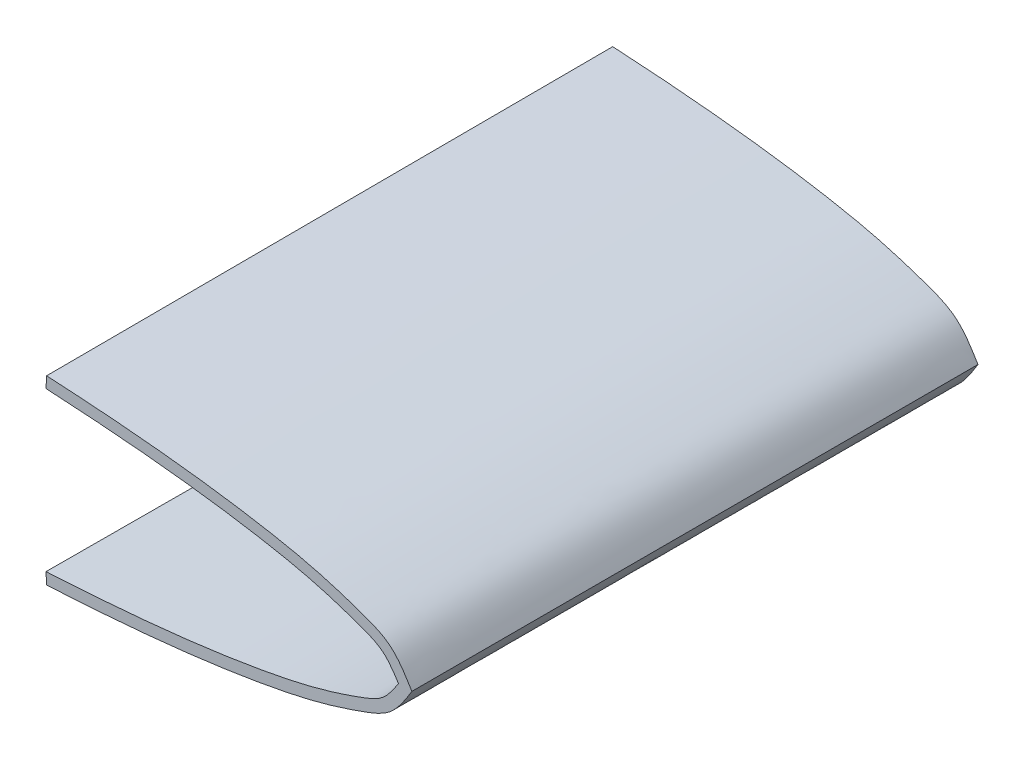
ISO-10303-21;
HEADER;
FILE_DESCRIPTION(('STEP AP214'),'2;1');
FILE_NAME('part.step','',(''),(''),'','','');
FILE_SCHEMA(('AUTOMOTIVE_DESIGN { 1 0 10303 214 1 1 1 1 }'));
ENDSEC;
DATA;
#1=APPLICATION_CONTEXT('core data for automotive mechanical design processes');
#2=APPLICATION_PROTOCOL_DEFINITION('international standard','automotive_design',2000,#1);
#3=PRODUCT_CONTEXT('',#1,'mechanical');
#4=PRODUCT('Part','Part','',(#3));
#5=PRODUCT_RELATED_PRODUCT_CATEGORY('part','',(#4));
#6=PRODUCT_DEFINITION_FORMATION('','',#4);
#7=PRODUCT_DEFINITION_CONTEXT('part definition',#1,'design');
#8=PRODUCT_DEFINITION('design','',#6,#7);
#9=PRODUCT_DEFINITION_SHAPE('','',#8);
#10=(LENGTH_UNIT() NAMED_UNIT(*) SI_UNIT(.MILLI.,.METRE.));
#11=(NAMED_UNIT(*) PLANE_ANGLE_UNIT() SI_UNIT($,.RADIAN.));
#12=(NAMED_UNIT(*) SI_UNIT($,.STERADIAN.) SOLID_ANGLE_UNIT());
#13=UNCERTAINTY_MEASURE_WITH_UNIT(LENGTH_MEASURE(1.E-05),#10,'distance_accuracy_value','');
#14=(GEOMETRIC_REPRESENTATION_CONTEXT(3) GLOBAL_UNCERTAINTY_ASSIGNED_CONTEXT((#13)) GLOBAL_UNIT_ASSIGNED_CONTEXT((#10,
#11,#12)) REPRESENTATION_CONTEXT('',''));
#15=CARTESIAN_POINT('',(0.,0.,0.));
#16=DIRECTION('',(0.,0.,1.));
#17=DIRECTION('',(1.,0.,0.));
#18=AXIS2_PLACEMENT_3D('',#15,#16,#17);
#19=CARTESIAN_POINT('',(42.4994409675227,-7.78666682857099,-78.7400000000001));
#20=DIRECTION('',(0.,0.,1.));
#21=DIRECTION('',(1.,0.,0.));
#22=AXIS2_PLACEMENT_3D('',#19,#20,#21);
#23=PLANE('',#22);
#24=CARTESIAN_POINT('',(65.912918026067,-16.5582165461445,-78.7400000000001));
#25=CARTESIAN_POINT('',(65.4051754198435,-15.7414320824596,-78.7400000000001));
#26=CARTESIAN_POINT('',(64.8712305259762,-14.9342814721549,-78.7400000000001));
#27=CARTESIAN_POINT('',(64.1259820532635,-14.1435545116777,-78.7400000000001));
#28=CARTESIAN_POINT('',(63.7114342340601,-13.7326302608691,-78.7400000000001));
#29=CARTESIAN_POINT('',(63.0598625118335,-13.2573691826656,-78.7400000000001));
#30=CARTESIAN_POINT('',(62.4621181818974,-12.9413064471122,-78.7400000000001));
#31=CARTESIAN_POINT('',(61.8451279256446,-12.644236714314,-78.7400000000001));
#32=CARTESIAN_POINT('',(61.2975436619765,-12.426313317413,-78.7400000000001));
#33=CARTESIAN_POINT('',(59.7274700350331,-11.8352794065414,-78.7400000000001));
#34=CARTESIAN_POINT('',(58.5822872567446,-11.4474134725801,-78.7400000000001));
#35=CARTESIAN_POINT('',(55.7838469102679,-10.5476064946807,-78.7400000000001));
#36=CARTESIAN_POINT('',(52.9537695598002,-9.75512543055187,-78.7400000000001));
#37=CARTESIAN_POINT('',(49.8902545387719,-9.10224811646429,-78.7400000000001));
#38=CARTESIAN_POINT('',(46.9918907902114,-8.53013880862471,-78.7400000000001));
#39=CARTESIAN_POINT('',(41.9226182244394,-7.64302783359646,-78.7400000000001));
#40=CARTESIAN_POINT('',(31.4130047824203,-6.26711743418939,-78.7400000000001));
#41=CARTESIAN_POINT('',(22.5151023614594,-5.58006173367422,-78.7400000000001));
#42=CARTESIAN_POINT('',(16.8827203981453,-5.25617519469147,-78.7400000000001));
#43=B_SPLINE_CURVE_WITH_KNOTS('',3,(#24,#25,#26,#27,#28,#29,#30,#31,#32,#33,#34,#35,#36,#37,#38,
#39,#40,#41,#42),.UNSPECIFIED.,.F.,.F.,(4,2,1,1,2,1,1,2,1,1,1,1,1,4),(0.,0.056020952878219,
0.0632821412888892,0.0900386062661922,0.102780271260974,0.130001493018324,0.137052313819946,
0.200360371551541,0.308278431316947,0.371601011458721,0.382771952956304,0.480361358725566,
0.671367967232721,1.),.UNSPECIFIED.);
#44=CARTESIAN_POINT('',(65.9129180260669,-16.5582165461404,-78.7400000000001));
#45=VERTEX_POINT('',#44);
#46=CARTESIAN_POINT('',(16.8827203981453,-5.25617519469148,-78.7400000000001));
#47=VERTEX_POINT('',#46);
#48=EDGE_CURVE('E169',#45,#47,#43,.T.);
#49=ORIENTED_EDGE('',*,*,#48,.T.);
#50=DIRECTION('',(0.0574095221756193,0.998350713308488,0.));
#51=VECTOR('',#50,1.);
#52=CARTESIAN_POINT('',(16.8827203981453,-5.25617519469148,-78.7400000000001));
#53=LINE('',#52,#51);
#54=CARTESIAN_POINT('',(16.9738580145991,-3.67129343731425,-78.7400000000001));
#55=VERTEX_POINT('',#54);
#56=EDGE_CURVE('E12',#47,#55,#53,.T.);
#57=ORIENTED_EDGE('',*,*,#56,.T.);
#58=CARTESIAN_POINT('',(16.9738580145991,-3.67129343731425,-78.7400000000001));
#59=CARTESIAN_POINT('',(21.3610222432848,-3.92357452322658,-78.7400000000001));
#60=CARTESIAN_POINT('',(27.9320133204333,-4.40240207410101,-78.7400000000001));
#61=CARTESIAN_POINT('',(36.6850392393515,-5.35022984393427,-78.7400000000001));
#62=CARTESIAN_POINT('',(42.1444388642442,-6.1023419339073,-78.7400000000001));
#63=CARTESIAN_POINT('',(46.5023997057977,-6.82833405509119,-78.7400000000001));
#64=CARTESIAN_POINT('',(49.7593752667435,-7.44445760496007,-78.7400000000001));
#65=CARTESIAN_POINT('',(53.0289719072204,-8.15982598000776,-78.7400000000001));
#66=CARTESIAN_POINT('',(55.7271254344392,-8.88694329866122,-78.7400000000001));
#67=CARTESIAN_POINT('',(57.8653806359954,-9.54410235808814,-78.7400000000001));
#68=CARTESIAN_POINT('',(59.4497461815499,-10.0636400416173,-78.7400000000001));
#69=CARTESIAN_POINT('',(61.0337248389187,-10.6286250642282,-78.7400000000001));
#70=CARTESIAN_POINT('',(62.6317137685341,-11.2192179546496,-78.7400000000001));
#71=CARTESIAN_POINT('',(64.117674304596,-12.0184266410054,-78.7400000000001));
#72=CARTESIAN_POINT('',(65.0481280840643,-12.8074853747339,-78.7400000000001));
#73=CARTESIAN_POINT('',(65.5200370370229,-13.3059644278922,-78.7400000000001));
#74=CARTESIAN_POINT('',(65.9305881033177,-13.7829529798619,-78.7400000000001));
#75=CARTESIAN_POINT('',(66.4022674273108,-14.4024174040977,-78.7400000000001));
#76=CARTESIAN_POINT('',(66.9019084305486,-15.1436815216202,-78.7400000000001));
#77=CARTESIAN_POINT('',(67.3532340427676,-15.8678189686269,-78.7400000000001));
#78=CARTESIAN_POINT('',(67.6378189373782,-16.3260391783732,-78.7400000000001));
#79=CARTESIAN_POINT('',(67.782148740542,-16.5582165442787,-78.7400000000001));
#80=B_SPLINE_CURVE_WITH_KNOTS('',3,(#58,#59,#60,#61,#62,#63,#64,#65,#66,#67,#68,#69,#70,#71,#72,
#73,#74,#75,#76,#77,#78,#79),.UNSPECIFIED.,.F.,.F.,(4,1,1,1,1,1,1,1,1,1,1,1,1,1,1,1,1,1,1,4),
(0.,0.254790297378543,0.382185446067814,0.509580594757086,0.573278169101721,0.636975743446357,
0.700673317790993,0.764370892135629,0.796219679307947,0.828068466480264,0.859917253652582,
0.8917660408249,0.923614827997218,0.939539221583377,0.947501418376457,0.955463615169536,
0.971388008755695,0.987312402341854,1.00323679592801,1.01916118951417),.UNSPECIFIED.);
#81=CARTESIAN_POINT('',(67.782148740542,-16.5582165442787,-78.7400000000001));
#82=VERTEX_POINT('',#81);
#83=EDGE_CURVE('E96',#55,#82,#80,.T.);
#84=ORIENTED_EDGE('',*,*,#83,.T.);
#85=CARTESIAN_POINT('',(67.782148740542,-16.5582165442787,-78.7400000000001));
#86=CARTESIAN_POINT('',(67.6378184565921,-16.7903946846373,-78.7400000000001));
#87=CARTESIAN_POINT('',(67.3531549981243,-17.248765457214,-78.7400000000001));
#88=CARTESIAN_POINT('',(66.7518512057312,-18.2133910674919,-78.7400000000001));
#89=CARTESIAN_POINT('',(66.0538964057146,-19.2154979421198,-78.7400000000001));
#90=CARTESIAN_POINT('',(65.176908755767,-20.1819038543453,-78.7400000000001));
#91=CARTESIAN_POINT('',(64.5405073235338,-20.7444835771353,-78.7400000000001));
#92=CARTESIAN_POINT('',(63.9413313096434,-21.1584819458414,-78.7400000000001));
#93=CARTESIAN_POINT('',(63.3855108058696,-21.4892270910685,-78.7400000000001));
#94=CARTESIAN_POINT('',(62.3765067056171,-21.9910944679847,-78.7400000000001));
#95=CARTESIAN_POINT('',(61.026726826321,-22.4979629506535,-78.7400000000001));
#96=CARTESIAN_POINT('',(59.4569303867627,-23.0509993557861,-78.7400000000001));
#97=CARTESIAN_POINT('',(57.8677527353638,-23.5777306943511,-78.7400000000001));
#98=CARTESIAN_POINT('',(55.7279227176323,-24.2324662856941,-78.7400000000001));
#99=CARTESIAN_POINT('',(53.0284573983001,-24.9570106459972,-78.7400000000001));
#100=CARTESIAN_POINT('',(49.761047516118,-25.6739619125,-78.7400000000001));
#101=CARTESIAN_POINT('',(46.5010333110795,-26.2901839296503,-78.7400000000001));
#102=CARTESIAN_POINT('',(42.1428085885765,-27.0117695085257,-78.7400000000001));
#103=CARTESIAN_POINT('',(36.6875991070444,-27.7663817006911,-78.7400000000001));
#104=CARTESIAN_POINT('',(27.9327690259257,-28.7196212502407,-78.7400000000001));
#105=CARTESIAN_POINT('',(21.3613786345462,-29.1928380833508,-78.7400000000001));
#106=CARTESIAN_POINT('',(16.9738580096687,-29.4451396552437,-78.7400000000001));
#107=B_SPLINE_CURVE_WITH_KNOTS('',3,(#85,#86,#87,#88,#89,#90,#91,#92,#93,#94,#95,#96,#97,#98,
#99,#100,#101,#102,#103,#104,#105,#106),.UNSPECIFIED.,.F.,.F.,(4,1,1,1,1,1,1,1,1,1,1,1,1,1,1,1,
1,1,1,4),(-0.0191611243996706,-0.00323673183092574,0.0126876607378191,0.0445364458753088,
0.0604608384440537,0.0763852310127985,0.084347427297171,0.0923096235815434,0.108234016150288,
0.140082801287778,0.171931586425268,0.203780371562757,0.235629156700247,0.299326726975226,
0.363024297250206,0.426721867525185,0.490419437800165,0.617814578350124,0.745209718900082,1.),.UNSPECIFIED.);
#108=CARTESIAN_POINT('',(16.9738580096687,-29.4451396552437,-78.7400000000001));
#109=VERTEX_POINT('',#108);
#110=EDGE_CURVE('E305',#82,#109,#107,.T.);
#111=ORIENTED_EDGE('',*,*,#110,.T.);
#112=DIRECTION('',(-0.057409520280624,0.998350713417459,0.));
#113=VECTOR('',#112,1.);
#114=CARTESIAN_POINT('',(16.9738580096687,-29.4451396552437,-78.7400000000001));
#115=LINE('',#114,#113);
#116=CARTESIAN_POINT('',(16.8827203962232,-27.8602578976934,-78.7400000000001));
#117=VERTEX_POINT('',#116);
#118=EDGE_CURVE('E308',#109,#117,#115,.T.);
#119=ORIENTED_EDGE('',*,*,#118,.T.);
#120=CARTESIAN_POINT('',(16.8827203962232,-27.8602578976934,-78.7400000000001));
#121=CARTESIAN_POINT('',(24.9224395055721,-27.3979389840536,-78.7400000000001));
#122=CARTESIAN_POINT('',(34.0403066335562,-26.6293291934245,-78.7400000000001));
#123=CARTESIAN_POINT('',(44.7284109682597,-24.9889687964561,-78.7400000000001));
#124=CARTESIAN_POINT('',(47.9217677201928,-24.4187160244967,-78.7400000000001));
#125=CARTESIAN_POINT('',(50.0334641952933,-23.9810752414718,-78.7400000000001));
#126=CARTESIAN_POINT('',(52.6478319019627,-23.4215867039075,-78.7400000000001));
#127=CARTESIAN_POINT('',(55.0037047582013,-22.8118127692071,-78.7400000000001));
#128=CARTESIAN_POINT('',(57.8775327491502,-21.9035287687069,-78.7400000000001));
#129=CARTESIAN_POINT('',(59.1313694309051,-21.4838236237442,-78.7400000000001));
#130=CARTESIAN_POINT('',(60.7555217704745,-20.9091152098904,-78.7400000000001));
#131=CARTESIAN_POINT('',(61.8166663329984,-20.4966226906722,-78.7400000000001));
#132=CARTESIAN_POINT('',(62.633467076932,-20.0859981347681,-78.7400000000001));
#133=CARTESIAN_POINT('',(62.8745534402461,-19.9500252331878,-78.7400000000001));
#134=CARTESIAN_POINT('',(63.4323963371715,-19.5917268397141,-78.7400000000001));
#135=CARTESIAN_POINT('',(63.9323024072292,-19.1819075029615,-78.7400000000001));
#136=CARTESIAN_POINT('',(64.91314080719,-18.1217083207127,-78.7400000000001));
#137=CARTESIAN_POINT('',(65.4925693023219,-17.234414100183,-78.7400000000001));
#138=CARTESIAN_POINT('',(65.9129180260669,-16.5582165461404,-78.7400000000001));
#139=B_SPLINE_CURVE_WITH_KNOTS('',3,(#120,#121,#122,#123,#124,#125,#126,#127,#128,#129,#130,
#131,#132,#133,#134,#135,#136,#137,#138),.UNSPECIFIED.,.F.,.F.,(4,1,1,1,2,1,1,1,1,2,2,1,1,4),
(0.,0.469095490609103,0.532399575259675,0.629870046051929,0.658029418698937,0.785616644807989,
0.799639973041673,0.833611529365395,0.862624477590298,0.899842883821135,0.916013478902435,
0.938504424064929,0.953621666156999,1.),.UNSPECIFIED.);
#140=EDGE_CURVE('E330',#117,#45,#139,.T.);
#141=ORIENTED_EDGE('',*,*,#140,.T.);
#142=EDGE_LOOP('',(#49,#57,#84,#111,#119,#141));
#143=FACE_BOUND('',#142,.T.);
#144=ADVANCED_FACE('F86',(#143),#23,.F.);
#145=CARTESIAN_POINT('',(43.0569285273842,-25.062787153739,0.));
#146=DIRECTION('',(0.,0.,-1.));
#147=DIRECTION('',(-1.,0.,0.));
#148=AXIS2_PLACEMENT_3D('',#145,#146,#147);
#149=PLANE('',#148);
#150=CARTESIAN_POINT('',(65.9127076514291,-16.5582165461401,0.));
#151=CARTESIAN_POINT('',(65.7711506115883,-16.7856422674928,0.));
#152=CARTESIAN_POINT('',(65.4783538594608,-17.2455414164728,0.));
#153=CARTESIAN_POINT('',(64.9008366287329,-18.081153769503,0.));
#154=CARTESIAN_POINT('',(64.145764091482,-18.986630750279,0.));
#155=CARTESIAN_POINT('',(63.211213658634,-19.7385838486893,0.));
#156=CARTESIAN_POINT('',(61.949242991473,-20.362231303004,0.));
#157=CARTESIAN_POINT('',(60.4252423684153,-20.9246372763417,0.));
#158=CARTESIAN_POINT('',(58.8717760787585,-21.4699070506127,0.));
#159=CARTESIAN_POINT('',(57.3349661757003,-21.9726447414802,0.));
#160=CARTESIAN_POINT('',(55.2816343610209,-22.594937775807,0.));
#161=CARTESIAN_POINT('',(52.6978617422679,-23.2733801040351,0.));
#162=CARTESIAN_POINT('',(49.5158465617297,-23.9536925868982,0.));
#163=CARTESIAN_POINT('',(46.2908662553914,-24.5457251850428,0.));
#164=CARTESIAN_POINT('',(41.9816901798967,-25.2484516364702,0.));
#165=CARTESIAN_POINT('',(36.5643850147354,-25.9771166526398,0.));
#166=CARTESIAN_POINT('',(27.8452707949958,-26.8858010750158,0.));
#167=CARTESIAN_POINT('',(21.2708834369739,-27.3451949173683,0.));
#168=CARTESIAN_POINT('',(16.8882404112069,-27.5817919743648,0.));
#169=B_SPLINE_CURVE_WITH_KNOTS('',3,(#150,#151,#152,#153,#154,#155,#156,#157,#158,#159,#160,
#161,#162,#163,#164,#165,#166,#167,#168),.UNSPECIFIED.,.F.,.F.,(4,1,1,1,1,1,1,1,1,1,1,1,1,1,1,1,
4),(0.00352292721138799,0.00658583470087744,0.00964874219036689,0.0157745571693458,
0.0219003721483247,0.0280261871273036,0.0341520021062826,0.0402778170852615,0.0464036320642404,
0.0525294470432193,0.0647810770011772,0.077032706959135,0.0892843369170929,0.101535966875051,
0.126039226790966,0.150542486706882,0.199549006538713),.UNSPECIFIED.);
#170=CARTESIAN_POINT('',(65.9127076514293,-16.5582165461448,0.));
#171=VERTEX_POINT('',#170);
#172=CARTESIAN_POINT('',(16.8882404112069,-27.5817919743648,0.));
#173=VERTEX_POINT('',#172);
#174=EDGE_CURVE('E146',#171,#173,#169,.T.);
#175=ORIENTED_EDGE('',*,*,#174,.T.);
#176=DIRECTION('',(0.0539065217640705,-0.998545986377843,0.));
#177=VECTOR('',#176,1.);
#178=CARTESIAN_POINT('',(16.8882404112069,-27.5817919743648,0.));
#179=LINE('',#178,#177);
#180=CARTESIAN_POINT('',(16.9738170145073,-29.1669837277396,0.));
#181=VERTEX_POINT('',#180);
#182=EDGE_CURVE('E171',#173,#181,#179,.T.);
#183=ORIENTED_EDGE('',*,*,#182,.T.);
#184=CARTESIAN_POINT('',(16.9738170145073,-29.1669837277396,0.));
#185=CARTESIAN_POINT('',(21.4577248653559,-28.9249198874686,0.));
#186=CARTESIAN_POINT('',(25.9454708329202,-28.6100529556599,0.));
#187=CARTESIAN_POINT('',(34.8961600347724,-27.772123762338,0.));
#188=CARTESIAN_POINT('',(39.3618343485607,-27.2484988003038,0.));
#189=CARTESIAN_POINT('',(44.9093582997015,-26.3804929946567,0.));
#190=CARTESIAN_POINT('',(46.0168590439899,-26.1964056221031,0.));
#191=CARTESIAN_POINT('',(48.2320882281606,-25.8043115716434,0.));
#192=CARTESIAN_POINT('',(49.3393291291691,-25.5959906851719,0.));
#193=CARTESIAN_POINT('',(51.544011488953,-25.1446563555797,0.));
#194=CARTESIAN_POINT('',(52.6425039030858,-24.9006409417306,0.));
#195=CARTESIAN_POINT('',(54.8154316102374,-24.3610590589844,0.));
#196=CARTESIAN_POINT('',(55.8921267948263,-24.0655335732051,0.));
#197=CARTESIAN_POINT('',(57.4988693744592,-23.5808233838774,0.));
#198=CARTESIAN_POINT('',(58.0321758257093,-23.4130457218217,0.));
#199=CARTESIAN_POINT('',(59.1003135046894,-23.0641303422299,0.));
#200=CARTESIAN_POINT('',(59.6370171128937,-22.8820168955108,0.));
#201=CARTESIAN_POINT('',(60.4398335368761,-22.6008320484503,0.));
#202=CARTESIAN_POINT('',(60.7066304303336,-22.5059765238579,0.));
#203=CARTESIAN_POINT('',(61.2377421151056,-22.3147239449678,0.));
#204=CARTESIAN_POINT('',(61.5066380543009,-22.2166570007035,0.));
#205=CARTESIAN_POINT('',(62.3100586547842,-21.9104750569681,0.));
#206=CARTESIAN_POINT('',(62.8397742240444,-21.6907511118835,0.));
#207=CARTESIAN_POINT('',(63.5875514459265,-21.3082051414409,0.));
#208=CARTESIAN_POINT('',(63.8307630897186,-21.1710959768911,0.));
#209=CARTESIAN_POINT('',(64.2994135162753,-20.87073234046,0.));
#210=CARTESIAN_POINT('',(64.5227003512474,-20.708586600025,0.));
#211=CARTESIAN_POINT('',(65.1585430686855,-20.1856989360981,0.));
#212=CARTESIAN_POINT('',(65.536561418152,-19.7894063021638,0.));
#213=CARTESIAN_POINT('',(66.2469383532136,-18.9261380643489,0.));
#214=CARTESIAN_POINT('',(66.5755440543528,-18.4608631889594,0.));
#215=CARTESIAN_POINT('',(66.9712415134216,-17.8547293017616,0.));
#216=CARTESIAN_POINT('',(67.0886972762786,-17.6714128793836,0.));
#217=CARTESIAN_POINT('',(67.2030590838863,-17.4891582097098,0.));
#218=CARTESIAN_POINT('',(67.2784521503389,-17.3682836568386,0.));
#219=CARTESIAN_POINT('',(67.3137069907343,-17.311549983405,0.));
#220=CARTESIAN_POINT('',(67.4940526890637,-17.0218063536886,0.));
#221=CARTESIAN_POINT('',(67.6383292477271,-16.7900114499155,0.));
#222=CARTESIAN_POINT('',(67.7826058063906,-16.5582165461423,0.));
#223=B_SPLINE_CURVE_WITH_KNOTS('',3,(#184,#185,#186,#187,#188,#189,#190,#191,#192,#193,#194,
#195,#196,#197,#198,#199,#200,#201,#202,#203,#204,#205,#206,#207,#208,#209,#210,#211,#212,#213,
#214,#215,#216,#217,#218,#219,#220,#221,#222),.UNSPECIFIED.,.F.,.F.,(4,2,2,2,2,2,2,2,2,2,2,2,2,
2,2,2,1,2,2,4),(0.,0.250000000000002,0.500000000000003,0.562500000000004,0.625000000000004,
0.687500000000004,0.750000000000005,0.781250000000005,0.812500000000005,0.828125000000005,
0.843750000000005,0.875000000000005,0.890625000000005,0.906250000000004,0.937500000000003,
0.968750000000002,0.976562500000002,0.980468750000002,0.984375000000002,1.),.UNSPECIFIED.);
#224=CARTESIAN_POINT('',(67.7826058063906,-16.5582165461424,0.));
#225=VERTEX_POINT('',#224);
#226=EDGE_CURVE('E175',#181,#225,#223,.T.);
#227=ORIENTED_EDGE('',*,*,#226,.T.);
#228=CARTESIAN_POINT('',(67.7826058063906,-16.5582165461424,0.));
#229=CARTESIAN_POINT('',(67.6383292477342,-16.3264216423805,0.));
#230=CARTESIAN_POINT('',(67.4940526890777,-16.0946267386187,0.));
#231=CARTESIAN_POINT('',(67.3137069907572,-15.8048831089164,0.));
#232=CARTESIAN_POINT('',(67.2784521503644,-15.7481494354871,0.));
#233=CARTESIAN_POINT('',(67.2030590839158,-15.6272748826221,0.));
#234=CARTESIAN_POINT('',(67.0886972763145,-15.4450202129578,0.));
#235=CARTESIAN_POINT('',(66.9712415134638,-15.2617037905886,0.));
#236=CARTESIAN_POINT('',(66.5755440544165,-14.6555699034193,0.));
#237=CARTESIAN_POINT('',(66.2469383532956,-14.1902950280485,0.));
#238=CARTESIAN_POINT('',(65.5365614182799,-13.3270267902637,0.));
#239=CARTESIAN_POINT('',(65.1585430688441,-12.9307341563421,0.));
#240=CARTESIAN_POINT('',(64.5227003514574,-12.407846492419,0.));
#241=CARTESIAN_POINT('',(64.2994135165027,-12.245700751983,0.));
#242=CARTESIAN_POINT('',(63.8307630899806,-11.9453371155482,0.));
#243=CARTESIAN_POINT('',(63.5875514462053,-11.8082279509959,0.));
#244=CARTESIAN_POINT('',(62.839774224375,-11.4256819805492,0.));
#245=CARTESIAN_POINT('',(62.31005865515,-11.2059580354655,0.));
#246=CARTESIAN_POINT('',(61.5066380547159,-10.8997760917362,0.));
#247=CARTESIAN_POINT('',(61.2377421155362,-10.8017091474745,0.));
#248=CARTESIAN_POINT('',(60.7066304307907,-10.6104565685893,0.));
#249=CARTESIAN_POINT('',(60.4398335373456,-10.5156010439995,0.));
#250=CARTESIAN_POINT('',(59.6370171133988,-10.2344161969466,0.));
#251=CARTESIAN_POINT('',(59.1003135052201,-10.0523027502328,0.));
#252=CARTESIAN_POINT('',(58.0321758262946,-9.70338737064968,0.));
#253=CARTESIAN_POINT('',(57.4988693750717,-9.53560970859737,0.));
#254=CARTESIAN_POINT('',(55.8921267955213,-9.05089951927816,0.));
#255=CARTESIAN_POINT('',(54.8154316109915,-8.75537403350108,0.));
#256=CARTESIAN_POINT('',(52.6425039039579,-8.21579215075615,0.));
#257=CARTESIAN_POINT('',(51.5440114898841,-7.97177673690676,0.));
#258=CARTESIAN_POINT('',(49.3393291302154,-7.52044240731546,0.));
#259=CARTESIAN_POINT('',(48.232088229263,-7.31212152084532,0.));
#260=CARTESIAN_POINT('',(46.0168590452052,-6.92002747038828,0.));
#261=CARTESIAN_POINT('',(44.9093583009729,-6.73594009783537,0.));
#262=CARTESIAN_POINT('',(39.361834350113,-5.86793429218854,0.));
#263=CARTESIAN_POINT('',(34.896160036555,-5.34430933014573,0.));
#264=CARTESIAN_POINT('',(25.9454708351552,-4.50638013680094,0.));
#265=CARTESIAN_POINT('',(21.4577248678158,-4.19151320497839,0.));
#266=CARTESIAN_POINT('',(16.9738170171927,-3.94944936468991,0.));
#267=B_SPLINE_CURVE_WITH_KNOTS('',3,(#228,#229,#230,#231,#232,#233,#234,#235,#236,#237,#238,
#239,#240,#241,#242,#243,#244,#245,#246,#247,#248,#249,#250,#251,#252,#253,#254,#255,#256,#257,
#258,#259,#260,#261,#262,#263,#264,#265,#266),.UNSPECIFIED.,.F.,.F.,(4,2,2,1,2,2,2,2,2,2,2,2,2,
2,2,2,2,2,2,4),(0.,0.0156250000000002,0.0195312500000004,0.0234375000000005,0.0312500000000004,
0.0625000000000004,0.0937500000000003,0.109375,0.125,0.15625,0.171875,0.1875,0.21875,0.25,
0.3125,0.375,0.4375,0.5,0.75,1.),.UNSPECIFIED.);
#268=CARTESIAN_POINT('',(16.9738170171927,-3.94944936468991,0.));
#269=VERTEX_POINT('',#268);
#270=EDGE_CURVE('E247',#225,#269,#267,.T.);
#271=ORIENTED_EDGE('',*,*,#270,.T.);
#272=DIRECTION('',(-0.0539065217706445,-0.998545986377488,0.));
#273=VECTOR('',#272,1.);
#274=CARTESIAN_POINT('',(16.8882404138818,-5.53464111806417,0.));
#275=LINE('',#274,#273);
#276=CARTESIAN_POINT('',(16.8882404138818,-5.53464111806417,0.));
#277=VERTEX_POINT('',#276);
#278=EDGE_CURVE('E149',#269,#277,#275,.T.);
#279=ORIENTED_EDGE('',*,*,#278,.T.);
#280=CARTESIAN_POINT('',(16.8882404138818,-5.53464111806417,0.));
#281=CARTESIAN_POINT('',(21.2708834394235,-5.77123817507745,0.));
#282=CARTESIAN_POINT('',(27.8452707971078,-6.23063201744975,0.));
#283=CARTESIAN_POINT('',(36.5643850163927,-7.13931643984419,0.));
#284=CARTESIAN_POINT('',(41.9816901812687,-7.86798145601763,0.));
#285=CARTESIAN_POINT('',(46.2908662565406,-8.57070790744195,0.));
#286=CARTESIAN_POINT('',(49.5158465627081,-9.16274050557958,0.));
#287=CARTESIAN_POINT('',(52.6978617430661,-9.84305298843968,0.));
#288=CARTESIAN_POINT('',(55.2816343616736,-10.5214953166632,0.));
#289=CARTESIAN_POINT('',(57.3349661762486,-11.1437883509777,0.));
#290=CARTESIAN_POINT('',(58.8717760792262,-11.6465260418317,0.));
#291=CARTESIAN_POINT('',(60.4252423688191,-12.1917958160866,0.));
#292=CARTESIAN_POINT('',(61.9492429917562,-12.7542017893993,0.));
#293=CARTESIAN_POINT('',(63.2112136587918,-13.3778492436978,0.));
#294=CARTESIAN_POINT('',(64.1457640915734,-14.1298023421049,0.));
#295=CARTESIAN_POINT('',(64.9008366287852,-15.0352793228533,0.));
#296=CARTESIAN_POINT('',(65.478353859483,-15.8708916758465,0.));
#297=CARTESIAN_POINT('',(65.7711506115955,-16.3307908248034,0.));
#298=CARTESIAN_POINT('',(65.9127076514293,-16.5582165461448,0.));
#299=B_SPLINE_CURVE_WITH_KNOTS('',3,(#280,#281,#282,#283,#284,#285,#286,#287,#288,#289,#290,
#291,#292,#293,#294,#295,#296,#297,#298),.UNSPECIFIED.,.F.,.F.,(4,1,1,1,1,1,1,1,1,1,1,1,1,1,1,1,
4),(0.800450993471251,0.849457513300591,0.873960773215262,0.898464033129932,0.910715663087267,
0.922967293044602,0.935218923001937,0.947470552959273,0.95359636793794,0.959722182916608,
0.965847997895275,0.971973812873943,0.978099627852611,0.984225442831278,0.990351257809946,
0.99341416529928,0.996477072788613),.UNSPECIFIED.);
#300=EDGE_CURVE('E142',#277,#171,#299,.T.);
#301=ORIENTED_EDGE('',*,*,#300,.T.);
#302=EDGE_LOOP('',(#175,#183,#227,#271,#279,#301));
#303=FACE_BOUND('',#302,.T.);
#304=ADVANCED_FACE('F145',(#303),#149,.F.);
#305=CARTESIAN_POINT('',(65.9127076514293,-16.5582165461448,0.));
#306=CARTESIAN_POINT('',(65.912918026067,-16.5582165461445,-78.7400000000001));
#307=CARTESIAN_POINT('',(65.4054282334328,-15.7432207840482,0.));
#308=CARTESIAN_POINT('',(65.4051754198435,-15.7414320824596,-78.7400000000001));
#309=CARTESIAN_POINT('',(64.8691076920377,-14.9402300545661,0.));
#310=CARTESIAN_POINT('',(64.8712305259762,-14.9342814721549,-78.7400000000001));
#311=CARTESIAN_POINT('',(64.1163912216855,-14.1581119098623,0.));
#312=CARTESIAN_POINT('',(64.1259820532635,-14.1435545116777,-78.7400000000001));
#313=CARTESIAN_POINT('',(63.6964444739377,-13.7535730580463,0.));
#314=CARTESIAN_POINT('',(63.7114342340601,-13.7326302608691,-78.7400000000001));
#315=CARTESIAN_POINT('',(63.0322298523042,-13.2964337472436,0.));
#316=CARTESIAN_POINT('',(63.0598625118335,-13.2573691826656,-78.7400000000001));
#317=CARTESIAN_POINT('',(62.4280793169053,-12.994944347189,0.));
#318=CARTESIAN_POINT('',(62.4621181818974,-12.9413064471122,-78.7400000000001));
#319=CARTESIAN_POINT('',(61.8069781882817,-12.7095966618987,0.));
#320=CARTESIAN_POINT('',(61.8451279256446,-12.644236714314,-78.7400000000001));
#321=CARTESIAN_POINT('',(61.2562920207636,-12.500957280539,0.));
#322=CARTESIAN_POINT('',(61.2975436619765,-12.426313317413,-78.7400000000001));
#323=CARTESIAN_POINT('',(59.682927487826,-11.9247780679435,0.));
#324=CARTESIAN_POINT('',(59.7274700350331,-11.8352794065414,-78.7400000000001));
#325=CARTESIAN_POINT('',(58.5404259384318,-11.535972555597,0.));
#326=CARTESIAN_POINT('',(58.5822872567446,-11.4474134725801,-78.7400000000001));
#327=CARTESIAN_POINT('',(55.742475705274,-10.6520170137537,0.));
#328=CARTESIAN_POINT('',(55.7838469102679,-10.5476064946807,-78.7400000000001));
#329=CARTESIAN_POINT('',(52.9143753815867,-9.87410261367509,0.));
#330=CARTESIAN_POINT('',(52.9537695598002,-9.75512543055187,-78.7400000000001));
#331=CARTESIAN_POINT('',(49.8515907452486,-9.24400671988326,0.));
#332=CARTESIAN_POINT('',(49.8902545387719,-9.10224811646429,-78.7400000000001));
#333=CARTESIAN_POINT('',(46.9552011640915,-8.68898900826315,0.));
#334=CARTESIAN_POINT('',(46.9918907902114,-8.53013880862471,-78.7400000000001));
#335=CARTESIAN_POINT('',(41.8923033356319,-7.82071154532488,0.));
#336=CARTESIAN_POINT('',(41.9226182244394,-7.64302783359646,-78.7400000000001));
#337=CARTESIAN_POINT('',(31.3946179060803,-6.49270606990186,0.));
#338=CARTESIAN_POINT('',(31.4130047824203,-6.26711743418939,-78.7400000000001));
#339=CARTESIAN_POINT('',(22.5115235653118,-5.83821415301749,0.));
#340=CARTESIAN_POINT('',(22.5151023614594,-5.58006173367422,-78.7400000000001));
#341=CARTESIAN_POINT('',(16.8882404138818,-5.53464111806417,0.));
#342=CARTESIAN_POINT('',(16.8827203981453,-5.25617519469147,-78.7400000000001));
#343=B_SPLINE_SURFACE_WITH_KNOTS('',3,1,((#305,#306),(#307,#308),(#309,#310),(#311,#312),(#313,
#314),(#315,#316),(#317,#318),(#319,#320),(#321,#322),(#323,#324),(#325,#326),(#327,#328),(#329,
#330),(#331,#332),(#333,#334),(#335,#336),(#337,#338),(#339,#340),(#341,#342)),.UNSPECIFIED.,
.F.,.F.,.F.,(4,2,1,1,2,1,1,2,1,1,1,1,1,4),(2,2),(0.,0.0560209528782191,0.0632821412888892,
0.090038606266192,0.102780271260974,0.130001493018324,0.137052313819946,0.200360371551541,
0.308278431316947,0.371601011458721,0.382771952956304,0.480361358725566,0.67136796723272,1.),
(0.,1.),.UNSPECIFIED.);
#344=DIRECTION('',(-7.01039014964528E-05,0.00353650217573716,-0.999993744099334));
#345=VECTOR('',#344,1.);
#346=CARTESIAN_POINT('',(16.8854804060135,-5.39540815637782,-39.3700000000001));
#347=LINE('',#346,#345);
#348=EDGE_CURVE('E104',#277,#47,#347,.T.);
#349=DIRECTION('',(-2.67176324314187E-06,0.,0.999999999996431));
#350=VECTOR('',#349,1.);
#351=CARTESIAN_POINT('',(65.9128128387482,-16.5582165461446,-39.3700000000001));
#352=LINE('',#351,#350);
#353=EDGE_CURVE('E161',#45,#171,#352,.T.);
#354=ORIENTED_EDGE('',*,*,#300,.F.);
#355=ORIENTED_EDGE('',*,*,#348,.T.);
#356=ORIENTED_EDGE('',*,*,#48,.F.);
#357=ORIENTED_EDGE('',*,*,#353,.T.);
#358=EDGE_LOOP('',(#354,#355,#356,#357));
#359=FACE_BOUND('',#358,.T.);
#360=ADVANCED_FACE('F168',(#359),#343,.T.);
#361=CARTESIAN_POINT('',(16.8882404138818,-5.53464111806417,0.));
#362=CARTESIAN_POINT('',(16.8827203981453,-5.25617519469148,-78.7400000000001));
#363=CARTESIAN_POINT('',(16.9025031811003,-5.2704424925018,0.));
#364=CARTESIAN_POINT('',(16.8979100008876,-4.9920282351286,-78.7400000000001));
#365=CARTESIAN_POINT('',(16.9167659483188,-5.00624386693942,0.));
#366=CARTESIAN_POINT('',(16.9130996036299,-4.72788127556573,-78.7400000000001));
#367=CARTESIAN_POINT('',(16.9452914827557,-4.47784661581466,0.));
#368=CARTESIAN_POINT('',(16.9434788091145,-4.19958735643999,-78.7400000000001));
#369=CARTESIAN_POINT('',(16.9595542499742,-4.21364799025229,0.));
#370=CARTESIAN_POINT('',(16.9586684118568,-3.93544039687712,-78.7400000000001));
#371=CARTESIAN_POINT('',(16.9738170171927,-3.94944936468991,0.));
#372=CARTESIAN_POINT('',(16.9738580145991,-3.67129343731425,-78.7400000000001));
#373=B_SPLINE_SURFACE_WITH_KNOTS('',3,1,((#361,#362),(#363,#364),(#365,#366),(#367,#368),(#369,
#370),(#371,#372)),.UNSPECIFIED.,.F.,.F.,.F.,(4,2,4),(2,2),(0.,0.5,1.),(0.,1.),.UNSPECIFIED.);
#374=DIRECTION('',(5.20664853852402E-07,0.00353256530116652,-0.999993760471595));
#375=VECTOR('',#374,1.);
#376=CARTESIAN_POINT('',(16.9738375158959,-3.81037140100208,-39.3700000000001));
#377=LINE('',#376,#375);
#378=EDGE_CURVE('E173',#269,#55,#377,.T.);
#379=ORIENTED_EDGE('',*,*,#278,.F.);
#380=ORIENTED_EDGE('',*,*,#378,.T.);
#381=ORIENTED_EDGE('',*,*,#56,.F.);
#382=ORIENTED_EDGE('',*,*,#348,.F.);
#383=EDGE_LOOP('',(#379,#380,#381,#382));
#384=FACE_BOUND('',#383,.T.);
#385=ADVANCED_FACE('F198',(#384),#373,.T.);
#386=CARTESIAN_POINT('',(16.8882404112069,-27.5817919743648,0.));
#387=CARTESIAN_POINT('',(16.8827203962232,-27.8602578976934,-78.7400000000001));
#388=CARTESIAN_POINT('',(24.9149729217568,-27.1484686856258,0.));
#389=CARTESIAN_POINT('',(24.9224395055721,-27.3979389840536,-78.7400000000001));
#390=CARTESIAN_POINT('',(34.0187504203404,-26.415880819573,0.));
#391=CARTESIAN_POINT('',(34.0403066335562,-26.6293291934245,-78.7400000000001));
#392=CARTESIAN_POINT('',(44.6947367915435,-24.8224914059402,0.));
#393=CARTESIAN_POINT('',(44.7284109682597,-24.9889687964561,-78.7400000000001));
#394=CARTESIAN_POINT('',(47.8842529777705,-24.2648841899138,0.));
#395=CARTESIAN_POINT('',(47.9217677201928,-24.4187160244967,-78.7400000000001));
#396=CARTESIAN_POINT('',(49.9950210120944,-23.8416503631514,0.));
#397=CARTESIAN_POINT('',(50.0334641952933,-23.9810752414718,-78.7400000000001));
#398=CARTESIAN_POINT('',(52.6087231025503,-23.3014907431756,0.));
#399=CARTESIAN_POINT('',(52.6478319019627,-23.4215867039075,-78.7400000000001));
#400=CARTESIAN_POINT('',(54.9642839319068,-22.7071850000566,0.));
#401=CARTESIAN_POINT('',(55.0037047582013,-22.8118127692071,-78.7400000000001));
#402=CARTESIAN_POINT('',(57.8363585035165,-21.8112727546606,0.));
#403=CARTESIAN_POINT('',(57.8775327491502,-21.9035287687069,-78.7400000000001));
#404=CARTESIAN_POINT('',(59.0893836630611,-21.3963083036024,0.));
#405=CARTESIAN_POINT('',(59.1313694309051,-21.4838236237442,-78.7400000000001));
#406=CARTESIAN_POINT('',(60.7109669073164,-20.8253970114755,0.));
#407=CARTESIAN_POINT('',(60.7555217704745,-20.9091152098904,-78.7400000000001));
#408=CARTESIAN_POINT('',(61.7780898741065,-20.4304769183054,0.));
#409=CARTESIAN_POINT('',(61.8166663329984,-20.4966226906722,-78.7400000000001));
#410=CARTESIAN_POINT('',(62.6007679965429,-20.035983186809,0.));
#411=CARTESIAN_POINT('',(62.633467076932,-20.0859981347681,-78.7400000000001));
#412=CARTESIAN_POINT('',(62.8450042593048,-19.9064770080414,0.));
#413=CARTESIAN_POINT('',(62.8745534402461,-19.9500252331878,-78.7400000000001));
#414=CARTESIAN_POINT('',(63.4122911657012,-19.5635660903981,0.));
#415=CARTESIAN_POINT('',(63.4323963371715,-19.5917268397141,-78.7400000000001));
#416=CARTESIAN_POINT('',(63.9193801068193,-19.1643549088653,0.));
#417=CARTESIAN_POINT('',(63.9323024072292,-19.1819075029615,-78.7400000000001));
#418=CARTESIAN_POINT('',(64.9118359721513,-18.1163410813148,0.));
#419=CARTESIAN_POINT('',(64.91314080719,-18.1217083207127,-78.7400000000001));
#420=CARTESIAN_POINT('',(65.4927427729741,-17.2329326572767,0.));
#421=CARTESIAN_POINT('',(65.4925693023219,-17.234414100183,-78.7400000000001));
#422=CARTESIAN_POINT('',(65.9127076514291,-16.5582165461401,0.));
#423=CARTESIAN_POINT('',(65.9129180260669,-16.5582165461404,-78.7400000000001));
#424=B_SPLINE_SURFACE_WITH_KNOTS('',3,1,((#386,#387),(#388,#389),(#390,#391),(#392,#393),(#394,
#395),(#396,#397),(#398,#399),(#400,#401),(#402,#403),(#404,#405),(#406,#407),(#408,#409),(#410,
#411),(#412,#413),(#414,#415),(#416,#417),(#418,#419),(#420,#421),(#422,#423)),.UNSPECIFIED.,
.F.,.F.,.F.,(4,1,1,1,2,1,1,1,1,2,2,1,1,4),(2,2),(0.,0.469095490609104,0.532399575259675,
0.629870046051929,0.658029418698938,0.785616644807989,0.799639973041673,0.833611529365395,
0.862624477590298,0.899842883821135,0.916013478902434,0.938504424064929,0.953621666156998,1.),
(0.,1.),.UNSPECIFIED.);
#425=DIRECTION('',(-7.01038919354413E-05,-0.00353650217517798,-0.999993744099337));
#426=VECTOR('',#425,1.);
#427=CARTESIAN_POINT('',(16.8854804037151,-27.7210249360291,-39.3700000000001));
#428=LINE('',#427,#426);
#429=EDGE_CURVE('E163',#173,#117,#428,.T.);
#430=ORIENTED_EDGE('',*,*,#174,.F.);
#431=ORIENTED_EDGE('',*,*,#353,.F.);
#432=ORIENTED_EDGE('',*,*,#140,.F.);
#433=ORIENTED_EDGE('',*,*,#429,.F.);
#434=EDGE_LOOP('',(#430,#431,#432,#433));
#435=FACE_BOUND('',#434,.T.);
#436=ADVANCED_FACE('F159',(#435),#424,.T.);
#437=CARTESIAN_POINT('',(16.9738170171927,-3.94944936468991,0.));
#438=CARTESIAN_POINT('',(16.9738580145991,-3.67129343731425,-78.7400000000001));
#439=CARTESIAN_POINT('',(21.4577248678158,-4.19151320497839,0.));
#440=CARTESIAN_POINT('',(21.3610222432848,-3.92357452322658,-78.7400000000001));
#441=CARTESIAN_POINT('',(25.9454708351552,-4.50638013680094,0.));
#442=CARTESIAN_POINT('',(25.7416829613838,-4.2427928904762,-78.7400000000001));
#443=CARTESIAN_POINT('',(32.658487736205,-5.13482703180953,0.));
#444=CARTESIAN_POINT('',(32.3085262798924,-4.87631595901764,-78.7400000000001));
#445=CARTESIAN_POINT('',(37.128997193334,-5.60612181116713,0.));
#446=CARTESIAN_POINT('',(36.6850392393515,-5.35022984393427,-78.7400000000001));
#447=CARTESIAN_POINT('',(41.5808439304569,-6.21513661444727,0.));
#448=CARTESIAN_POINT('',(41.0525589392657,-5.9519195159127,-78.7400000000001));
#449=CARTESIAN_POINT('',(44.9093583009729,-6.73594009783537,0.));
#450=CARTESIAN_POINT('',(44.3234192850209,-6.46533799449924,-78.7400000000001));
#451=CARTESIAN_POINT('',(46.0168590452052,-6.92002747038828,0.));
#452=CARTESIAN_POINT('',(45.4129094954093,-6.64683602479522,-78.7400000000001));
#453=CARTESIAN_POINT('',(48.232088229263,-7.31212152084532,0.));
#454=CARTESIAN_POINT('',(47.588058226113,-7.03370857171415,-78.7400000000001));
#455=CARTESIAN_POINT('',(49.3393291302154,-7.52044240731546,0.));
#456=CARTESIAN_POINT('',(48.6737167464282,-7.23908308833711,-78.7400000000001));
#457=CARTESIAN_POINT('',(51.5440114898841,-7.97177673690676,0.));
#458=CARTESIAN_POINT('',(50.8492408135692,-7.68291372997596,-78.7400000000001));
#459=CARTESIAN_POINT('',(52.6425039039579,-8.21579215075615,0.));
#460=CARTESIAN_POINT('',(51.9391063603948,-7.92136985499186,-78.7400000000001));
#461=CARTESIAN_POINT('',(54.8154316109915,-8.75537403350108,0.));
#462=CARTESIAN_POINT('',(54.1082333181079,-8.45067290746914,-78.7400000000001));
#463=CARTESIAN_POINT('',(55.8921267955213,-9.05089951927816,0.));
#464=CARTESIAN_POINT('',(55.1874947289954,-8.74151983493053,-78.7400000000001));
#465=CARTESIAN_POINT('',(57.4988693750717,-9.53560970859737,0.));
#466=CARTESIAN_POINT('',(56.7962530352173,-9.21552282837468,-78.7400000000001));
#467=CARTESIAN_POINT('',(58.0321758262946,-9.70338737064968,0.));
#468=CARTESIAN_POINT('',(57.3308168356063,-9.37981259323142,-78.7400000000001));
#469=CARTESIAN_POINT('',(59.1003135052201,-10.0523027502328,0.));
#470=CARTESIAN_POINT('',(58.3935024845136,-9.7172815859312,-78.7400000000001));
#471=CARTESIAN_POINT('',(59.6370171133988,-10.2344161969466,0.));
#472=CARTESIAN_POINT('',(58.9216243330317,-9.89046081377425,-78.7400000000001));
#473=CARTESIAN_POINT('',(60.4398335373456,-10.5156010439995,0.));
#474=CARTESIAN_POINT('',(59.7137103837626,-10.1615914903093,-78.7400000000001));
#475=CARTESIAN_POINT('',(60.7066304307907,-10.6104565685893,0.));
#476=CARTESIAN_POINT('',(59.9777229469984,-10.253862021616,-78.7400000000001));
#477=CARTESIAN_POINT('',(61.2377421155362,-10.8017091474745,0.));
#478=CARTESIAN_POINT('',(60.5063157144727,-10.44136371785,-78.7400000000001));
#479=CARTESIAN_POINT('',(61.5066380547159,-10.8997760917362,0.));
#480=CARTESIAN_POINT('',(60.7708959187111,-10.5365948827773,-78.7400000000001));
#481=CARTESIAN_POINT('',(62.31005865515,-11.2059580354655,0.));
#482=CARTESIAN_POINT('',(61.5663878154572,-10.8254893610353,-78.7400000000001));
#483=CARTESIAN_POINT('',(62.839774224375,-11.4256819805492,0.));
#484=CARTESIAN_POINT('',(62.0990507919956,-11.0223536578425,-78.7400000000001));
#485=CARTESIAN_POINT('',(63.5875514462053,-11.8082279509959,0.));
#486=CARTESIAN_POINT('',(62.944336185218,-11.4097644863546,-78.7400000000001));
#487=CARTESIAN_POINT('',(63.8307630899806,-11.9453371155482,0.));
#488=CARTESIAN_POINT('',(63.2338131376946,-11.5542538264088,-78.7400000000001));
#489=CARTESIAN_POINT('',(64.2994135165027,-12.245700751983,0.));
#490=CARTESIAN_POINT('',(63.8100328073098,-11.8804527754752,-78.7400000000001));
#491=CARTESIAN_POINT('',(64.5227003514574,-12.407846492419,0.));
#492=CARTESIAN_POINT('',(64.0967755244483,-12.0621623844872,-78.7400000000001));
#493=CARTESIAN_POINT('',(64.9465954963819,-12.7564382683678,0.));
#494=CARTESIAN_POINT('',(64.6493621785778,-12.4693173459931,-78.7400000000001));
#495=CARTESIAN_POINT('',(65.247313056767,-13.0357699220691,0.));
#496=CARTESIAN_POINT('',(65.0481280840643,-12.8074853747339,-78.7400000000001));
#497=CARTESIAN_POINT('',(65.6225047999159,-13.4393530056082,0.));
#498=CARTESIAN_POINT('',(65.5200370370229,-13.3059644278922,-78.7400000000001));
#499=CARTESIAN_POINT('',(65.8029527689108,-13.650752379433,0.));
#500=CARTESIAN_POINT('',(65.7253125701703,-13.5444587038771,-78.7400000000001));
#501=CARTESIAN_POINT('',(66.0693441195417,-13.9744779686023,0.));
#502=CARTESIAN_POINT('',(66.0249239681163,-13.9068458647091,-78.7400000000001));
#503=CARTESIAN_POINT('',(66.4112412038561,-14.4229324657339,0.));
#504=CARTESIAN_POINT('',(66.4022674273108,-14.4024174040976,-78.7400000000001));
#505=CARTESIAN_POINT('',(66.7338230380354,-14.898023458287,0.));
#506=CARTESIAN_POINT('',(66.7353614294693,-14.896593482446,-78.7400000000001));
#507=CARTESIAN_POINT('',(66.9712415134638,-15.2617037905886,0.));
#508=CARTESIAN_POINT('',(66.9731030833335,-15.2629438735783,-78.7400000000001));
#509=CARTESIAN_POINT('',(67.0886972763145,-15.4450202129578,0.));
#510=CARTESIAN_POINT('',(67.0889541983269,-15.4450486522372,-78.7400000000001));
#511=CARTESIAN_POINT('',(67.2030590839158,-15.6272748826221,0.));
#512=CARTESIAN_POINT('',(67.2013945166959,-15.624625283885,-78.7400000000001));
#513=CARTESIAN_POINT('',(67.2784521503644,-15.7481494354871,0.));
#514=CARTESIAN_POINT('',(67.2757210820568,-15.7436787254644,-78.7400000000001));
#515=CARTESIAN_POINT('',(67.3137069907572,-15.8048831089164,0.));
#516=CARTESIAN_POINT('',(67.3125675412948,-15.8028732898279,-78.7400000000001));
#517=CARTESIAN_POINT('',(67.4940526890777,-16.0946267386187,0.));
#518=CARTESIAN_POINT('',(67.4955264900729,-16.0969290735,-78.7400000000001));
#519=CARTESIAN_POINT('',(67.6383292477342,-16.3264216423805,0.));
#520=CARTESIAN_POINT('',(67.6378189373782,-16.3260391783732,-78.7400000000001));
#521=CARTESIAN_POINT('',(67.7826058063906,-16.5582165461424,0.));
#522=CARTESIAN_POINT('',(67.782148740542,-16.5582165442787,-78.7400000000001));
#523=B_SPLINE_SURFACE_WITH_KNOTS('',3,1,((#437,#438),(#439,#440),(#441,#442),(#443,#444),(#445,
#446),(#447,#448),(#449,#450),(#451,#452),(#453,#454),(#455,#456),(#457,#458),(#459,#460),(#461,
#462),(#463,#464),(#465,#466),(#467,#468),(#469,#470),(#471,#472),(#473,#474),(#475,#476),(#477,
#478),(#479,#480),(#481,#482),(#483,#484),(#485,#486),(#487,#488),(#489,#490),(#491,#492),(#493,
#494),(#495,#496),(#497,#498),(#499,#500),(#501,#502),(#503,#504),(#505,#506),(#507,#508),(#509,
#510),(#511,#512),(#513,#514),(#515,#516),(#517,#518),(#519,#520),(#521,#522)),.UNSPECIFIED.,
.F.,.F.,.F.,(4,2,1,2,2,2,2,2,2,2,2,2,2,2,2,1,1,2,1,2,1,2,2,4),(2,2),(0.,0.25,0.375,0.5,0.5625,
0.625,0.6875,0.75,0.78125,0.8125,0.828125,0.84375,0.875,0.890625,0.90625,0.921875,0.9296875,
0.9375,0.953125,0.96875,0.9765625,0.98046875,0.984375,1.),(0.,1.),.UNSPECIFIED.);
#524=DIRECTION('',(-5.80474788608573E-06,2.36694800718034E-11,-0.999999999983152));
#525=VECTOR('',#524,1.);
#526=CARTESIAN_POINT('',(67.7823772734663,-16.5582165452105,-39.3700000000001));
#527=LINE('',#526,#525);
#528=EDGE_CURVE('E338',#225,#82,#527,.T.);
#529=ORIENTED_EDGE('',*,*,#270,.F.);
#530=ORIENTED_EDGE('',*,*,#528,.T.);
#531=ORIENTED_EDGE('',*,*,#83,.F.);
#532=ORIENTED_EDGE('',*,*,#378,.F.);
#533=EDGE_LOOP('',(#529,#530,#531,#532));
#534=FACE_BOUND('',#533,.T.);
#535=ADVANCED_FACE('F391',(#534),#523,.T.);
#536=CARTESIAN_POINT('',(67.7826058063906,-16.5582165461423,0.));
#537=CARTESIAN_POINT('',(67.782148740542,-16.5582165442787,-78.7400000000001));
#538=CARTESIAN_POINT('',(67.6383292477271,-16.7900114499155,0.));
#539=CARTESIAN_POINT('',(67.6378184565921,-16.7903946846373,-78.7400000000001));
#540=CARTESIAN_POINT('',(67.4940526890637,-17.0218063536886,0.));
#541=CARTESIAN_POINT('',(67.4954867273582,-17.0195800709256,-78.7400000000001));
#542=CARTESIAN_POINT('',(67.3137069907343,-17.311549983405,0.));
#543=CARTESIAN_POINT('',(67.3125756790256,-17.3135436889618,-78.7400000000001));
#544=CARTESIAN_POINT('',(67.2784521503389,-17.3682836568386,0.));
#545=CARTESIAN_POINT('',(67.2757436500196,-17.3727105068278,-78.7400000000001));
#546=CARTESIAN_POINT('',(67.2030590838863,-17.4891582097098,0.));
#547=CARTESIAN_POINT('',(67.2014531676659,-17.4917028914072,-78.7400000000001));
#548=CARTESIAN_POINT('',(67.0886972762786,-17.6714128793836,0.));
#549=CARTESIAN_POINT('',(67.0890778076229,-17.6711795915475,-78.7400000000001));
#550=CARTESIAN_POINT('',(66.9712415134216,-17.8547293017616,0.));
#551=CARTESIAN_POINT('',(66.973313002561,-17.8532181829856,-78.7400000000001));
#552=CARTESIAN_POINT('',(66.5755440543528,-18.4608631889594,0.));
#553=CARTESIAN_POINT('',(66.577362505727,-18.4639177861488,-78.7400000000001));
#554=CARTESIAN_POINT('',(66.2469383532136,-18.9261380643489,0.));
#555=CARTESIAN_POINT('',(66.2283851057188,-18.9649712234628,-78.7400000000001));
#556=CARTESIAN_POINT('',(65.7141556519174,-19.5735892427101,0.));
#557=CARTESIAN_POINT('',(65.6154025807408,-19.6987008982325,-78.7400000000001));
#558=CARTESIAN_POINT('',(65.3475522434187,-19.987552619131,0.));
#559=CARTESIAN_POINT('',(65.176908755767,-20.1819038543453,-78.7400000000001));
#560=CARTESIAN_POINT('',(64.9465954962061,-20.3599948240738,0.));
#561=CARTESIAN_POINT('',(64.6677876099805,-20.6319676325772,-78.7400000000001));
#562=CARTESIAN_POINT('',(64.6286741374871,-20.6214386560373,0.));
#563=CARTESIAN_POINT('',(64.2409193165887,-20.9514827614883,-78.7400000000001));
#564=CARTESIAN_POINT('',(64.4110569337613,-20.7896594702426,0.));
#565=CARTESIAN_POINT('',(63.9413313096434,-21.1584819458414,-78.7400000000001));
#566=CARTESIAN_POINT('',(64.1822509096361,-20.9458232495678,0.));
#567=CARTESIAN_POINT('',(63.6634210577566,-21.3238545184549,-78.7400000000001));
#568=CARTESIAN_POINT('',(63.8307630897186,-21.1710959768911,0.));
#569=CARTESIAN_POINT('',(63.2413673629765,-21.5609224306279,-78.7400000000001));
#570=CARTESIAN_POINT('',(63.5875514459265,-21.3082051414409,0.));
#571=CARTESIAN_POINT('',(62.95308047719,-21.7043131097468,-78.7400000000001));
#572=CARTESIAN_POINT('',(62.8397742240444,-21.6907511118835,0.));
#573=CARTESIAN_POINT('',(62.1065507297579,-22.0924681645185,-78.7400000000001));
#574=CARTESIAN_POINT('',(62.3100586547842,-21.9104750569681,0.));
#575=CARTESIAN_POINT('',(61.5666387780395,-22.295215557586,-78.7400000000001));
#576=CARTESIAN_POINT('',(61.5066380543009,-22.2166570007035,0.));
#577=CARTESIAN_POINT('',(60.7692557043611,-22.5855352036698,-78.7400000000001));
#578=CARTESIAN_POINT('',(61.2377421151056,-22.3147239449678,0.));
#579=CARTESIAN_POINT('',(60.5055421554516,-22.6800081784448,-78.7400000000001));
#580=CARTESIAN_POINT('',(60.7066304303336,-22.5059765238579,0.));
#581=CARTESIAN_POINT('',(59.9793883161222,-22.8655578429683,-78.7400000000001));
#582=CARTESIAN_POINT('',(60.4398335368761,-22.6008320484503,0.));
#583=CARTESIAN_POINT('',(59.7169480257024,-22.9566345327167,-78.7400000000001));
#584=CARTESIAN_POINT('',(59.6370171128937,-22.8820168955108,0.));
#585=CARTESIAN_POINT('',(58.9272045029631,-23.2265764686411,-78.7400000000001));
#586=CARTESIAN_POINT('',(59.1003135046894,-23.0641303422299,0.));
#587=CARTESIAN_POINT('',(58.3974786191635,-23.4021535814961,-78.7400000000001));
#588=CARTESIAN_POINT('',(58.0321758257093,-23.4130457218217,0.));
#589=CARTESIAN_POINT('',(57.3327952309309,-23.7414145921869,-78.7400000000001));
#590=CARTESIAN_POINT('',(57.4988693744592,-23.5808233838774,0.));
#591=CARTESIAN_POINT('',(56.7978377264981,-23.9050984900226,-78.7400000000001));
#592=CARTESIAN_POINT('',(55.8921267948263,-24.0655335732051,0.));
#593=CARTESIAN_POINT('',(55.188029653766,-24.3773751577547,-78.7400000000001));
#594=CARTESIAN_POINT('',(54.8154316102374,-24.3610590589844,0.));
#595=CARTESIAN_POINT('',(54.108243526033,-24.6671929018759,-78.7400000000001));
#596=CARTESIAN_POINT('',(52.6425039030858,-24.9006409417306,0.));
#597=CARTESIAN_POINT('',(51.9393207709062,-25.1959944014981,-78.7400000000001));
#598=CARTESIAN_POINT('',(51.544011488953,-25.1446563555797,0.));
#599=CARTESIAN_POINT('',(50.8501841435121,-25.434978156999,-78.7400000000001));
#600=CARTESIAN_POINT('',(49.3393291291691,-25.5959906851719,0.));
#601=CARTESIAN_POINT('',(48.6743761144386,-25.87936925155,-78.7400000000001));
#602=CARTESIAN_POINT('',(48.2320882281606,-25.8043115716434,0.));
#603=CARTESIAN_POINT('',(47.5877047127591,-26.0847765906001,-78.7400000000001));
#604=CARTESIAN_POINT('',(46.0168590439899,-26.1964056221031,0.));
#605=CARTESIAN_POINT('',(45.4114771304539,-26.4705803243691,-78.7400000000001));
#606=CARTESIAN_POINT('',(44.9093582997015,-26.3804929946567,0.));
#607=CARTESIAN_POINT('',(44.321920949828,-26.6509767190879,-78.7400000000001));
#608=CARTESIAN_POINT('',(41.580843929017,-26.9012964780449,0.));
#609=CARTESIAN_POINT('',(41.0517666922701,-27.1626919469587,-78.7400000000001));
#610=CARTESIAN_POINT('',(37.1289971916665,-27.5103112813209,0.));
#611=CARTESIAN_POINT('',(36.6875991070444,-27.7663817006911,-78.7400000000001));
#612=CARTESIAN_POINT('',(32.6584877343093,-27.9816060606685,0.));
#613=CARTESIAN_POINT('',(32.3101840664851,-28.2430014754659,-78.7400000000001));
#614=CARTESIAN_POINT('',(25.9454708329202,-28.6100529556599,0.));
#615=CARTESIAN_POINT('',(25.7423055621325,-28.8773601946108,-78.7400000000001));
#616=CARTESIAN_POINT('',(21.4577248653559,-28.9249198874686,0.));
#617=CARTESIAN_POINT('',(21.3613786345462,-29.1928380833508,-78.7400000000001));
#618=CARTESIAN_POINT('',(16.9738170145073,-29.1669837277396,0.));
#619=CARTESIAN_POINT('',(16.9738580096687,-29.4451396552437,-78.7400000000001));
#620=B_SPLINE_SURFACE_WITH_KNOTS('',3,1,((#536,#537),(#538,#539),(#540,#541),(#542,#543),(#544,
#545),(#546,#547),(#548,#549),(#550,#551),(#552,#553),(#554,#555),(#556,#557),(#558,#559),(#560,
#561),(#562,#563),(#564,#565),(#566,#567),(#568,#569),(#570,#571),(#572,#573),(#574,#575),(#576,
#577),(#578,#579),(#580,#581),(#582,#583),(#584,#585),(#586,#587),(#588,#589),(#590,#591),(#592,
#593),(#594,#595),(#596,#597),(#598,#599),(#600,#601),(#602,#603),(#604,#605),(#606,#607),(#608,
#609),(#610,#611),(#612,#613),(#614,#615),(#616,#617),(#618,#619)),.UNSPECIFIED.,.F.,.F.,.F.,(4,
2,2,1,2,2,1,2,1,2,2,2,2,2,2,2,2,2,2,2,1,2,4),(2,2),(0.,0.0156249999999983,0.0195312499999982,
0.0234374999999981,0.0312499999999977,0.0624999999999967,0.078125,0.0937499999999956,0.1015625,
0.109374999999995,0.124999999999995,0.156249999999995,0.171874999999995,0.187499999999995,
0.218749999999995,0.249999999999995,0.312499999999996,0.374999999999996,0.437499999999996,
0.499999999999997,0.625,0.749999999999998,1.),(0.,1.),.UNSPECIFIED.);
#621=DIRECTION('',(5.20636342085287E-07,-0.00353256530279708,-0.999993760471589));
#622=VECTOR('',#621,1.);
#623=CARTESIAN_POINT('',(16.973837512088,-29.3060616914916,-39.3700000000001));
#624=LINE('',#623,#622);
#625=EDGE_CURVE('E334',#181,#109,#624,.T.);
#626=ORIENTED_EDGE('',*,*,#226,.F.);
#627=ORIENTED_EDGE('',*,*,#625,.T.);
#628=ORIENTED_EDGE('',*,*,#110,.F.);
#629=ORIENTED_EDGE('',*,*,#528,.F.);
#630=EDGE_LOOP('',(#626,#627,#628,#629));
#631=FACE_BOUND('',#630,.T.);
#632=ADVANCED_FACE('F358',(#631),#620,.T.);
#633=CARTESIAN_POINT('',(16.9738170145073,-29.1669837277396,0.));
#634=CARTESIAN_POINT('',(16.9738580096687,-29.4451396552437,-78.7400000000001));
#635=CARTESIAN_POINT('',(16.9595542472906,-28.9027851021771,0.));
#636=CARTESIAN_POINT('',(16.9586684074278,-29.1809926956519,-78.7400000000001));
#637=CARTESIAN_POINT('',(16.9452914800738,-28.6385864766147,0.));
#638=CARTESIAN_POINT('',(16.9434788051869,-28.9168457360602,-78.7400000000001));
#639=CARTESIAN_POINT('',(16.9167659456404,-28.1101892254897,0.));
#640=CARTESIAN_POINT('',(16.913099600705,-28.3885518168768,-78.7400000000001));
#641=CARTESIAN_POINT('',(16.9025031784236,-27.8459905999272,0.));
#642=CARTESIAN_POINT('',(16.8979099984641,-28.1244048572851,-78.7400000000001));
#643=CARTESIAN_POINT('',(16.8882404112069,-27.5817919743648,0.));
#644=CARTESIAN_POINT('',(16.8827203962232,-27.8602578976934,-78.7400000000001));
#645=B_SPLINE_SURFACE_WITH_KNOTS('',3,1,((#633,#634),(#635,#636),(#637,#638),(#639,#640),(#641,
#642),(#643,#644)),.UNSPECIFIED.,.F.,.F.,.F.,(4,2,4),(2,2),(0.,0.5,1.),(0.,1.),.UNSPECIFIED.);
#646=ORIENTED_EDGE('',*,*,#182,.F.);
#647=ORIENTED_EDGE('',*,*,#429,.T.);
#648=ORIENTED_EDGE('',*,*,#118,.F.);
#649=ORIENTED_EDGE('',*,*,#625,.F.);
#650=EDGE_LOOP('',(#646,#647,#648,#649));
#651=FACE_BOUND('',#650,.T.);
#652=ADVANCED_FACE('F347',(#651),#645,.T.);
#653=CLOSED_SHELL('',(#144,#304,#360,#385,#436,#535,#632,#652));
#654=MANIFOLD_SOLID_BREP('B2',#653);
#655=ADVANCED_BREP_SHAPE_REPRESENTATION('',(#18,#654),#14);
#656=SHAPE_DEFINITION_REPRESENTATION(#9,#655);
ENDSEC;
END-ISO-10303-21;
